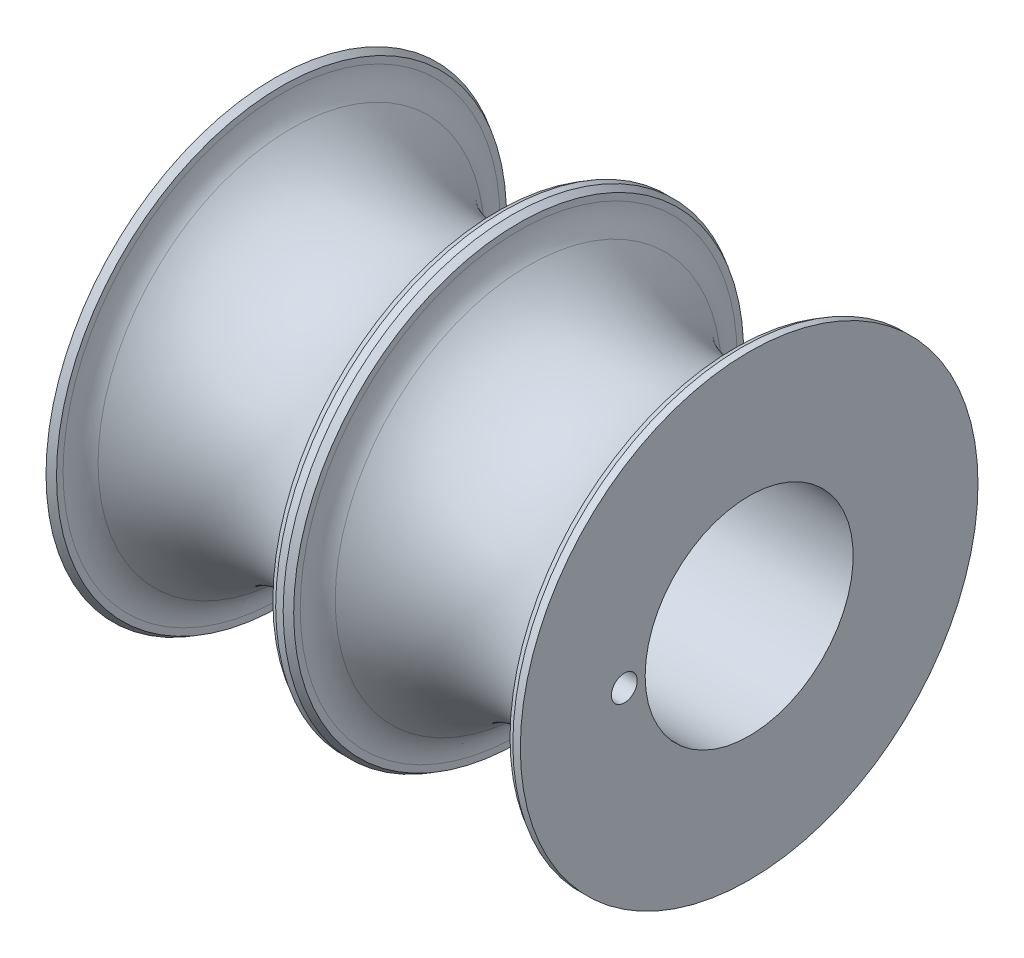
ISO-10303-21;
HEADER;
FILE_DESCRIPTION(('STEP AP214'),'2;1');
FILE_NAME('part.step','',(''),(''),'','','');
FILE_SCHEMA(('AUTOMOTIVE_DESIGN { 1 0 10303 214 1 1 1 1 }'));
ENDSEC;
DATA;
#1=APPLICATION_CONTEXT('core data for automotive mechanical design processes');
#2=APPLICATION_PROTOCOL_DEFINITION('international standard','automotive_design',2000,#1);
#3=PRODUCT_CONTEXT('',#1,'mechanical');
#4=PRODUCT('Part','Part','',(#3));
#5=PRODUCT_RELATED_PRODUCT_CATEGORY('part','',(#4));
#6=PRODUCT_DEFINITION_FORMATION('','',#4);
#7=PRODUCT_DEFINITION_CONTEXT('part definition',#1,'design');
#8=PRODUCT_DEFINITION('design','',#6,#7);
#9=PRODUCT_DEFINITION_SHAPE('','',#8);
#10=(LENGTH_UNIT() NAMED_UNIT(*) SI_UNIT(.MILLI.,.METRE.));
#11=(NAMED_UNIT(*) PLANE_ANGLE_UNIT() SI_UNIT($,.RADIAN.));
#12=(NAMED_UNIT(*) SI_UNIT($,.STERADIAN.) SOLID_ANGLE_UNIT());
#13=UNCERTAINTY_MEASURE_WITH_UNIT(LENGTH_MEASURE(1.E-05),#10,'distance_accuracy_value','');
#14=(GEOMETRIC_REPRESENTATION_CONTEXT(3) GLOBAL_UNCERTAINTY_ASSIGNED_CONTEXT((#13)) GLOBAL_UNIT_ASSIGNED_CONTEXT((#10,
#11,#12)) REPRESENTATION_CONTEXT('',''));
#15=CARTESIAN_POINT('',(0.,0.,0.));
#16=DIRECTION('',(0.,0.,1.));
#17=DIRECTION('',(1.,0.,0.));
#18=AXIS2_PLACEMENT_3D('',#15,#16,#17);
#19=CARTESIAN_POINT('',(0.,27.5,0.));
#20=DIRECTION('',(1.,0.,0.));
#21=DIRECTION('',(0.,0.,-1.));
#22=AXIS2_PLACEMENT_3D('',#19,#20,#21);
#23=PLANE('',#22);
#24=CARTESIAN_POINT('',(0.,0.,-15.));
#25=DIRECTION('',(-1.,0.,0.));
#26=DIRECTION('',(0.,0.,1.));
#27=AXIS2_PLACEMENT_3D('',#24,#25,#26);
#28=CIRCLE('',#27,1.5);
#29=CARTESIAN_POINT('',(0.,0.,-13.5));
#30=VERTEX_POINT('',#29);
#31=EDGE_CURVE('E70',#30,#30,#28,.T.);
#32=ORIENTED_EDGE('',*,*,#31,.F.);
#33=EDGE_LOOP('',(#32));
#34=FACE_BOUND('',#33,.T.);
#35=CARTESIAN_POINT('',(0.,0.,0.));
#36=DIRECTION('',(-1.,0.,0.));
#37=DIRECTION('',(0.,0.,1.));
#38=AXIS2_PLACEMENT_3D('',#35,#36,#37);
#39=CIRCLE('',#38,12.5);
#40=CARTESIAN_POINT('',(0.,0.,12.5));
#41=VERTEX_POINT('',#40);
#42=EDGE_CURVE('E81',#41,#41,#39,.T.);
#43=ORIENTED_EDGE('',*,*,#42,.F.);
#44=EDGE_LOOP('',(#43));
#45=FACE_BOUND('',#44,.T.);
#46=CARTESIAN_POINT('',(0.,0.,0.));
#47=DIRECTION('',(-1.,0.,0.));
#48=DIRECTION('',(0.,0.,1.));
#49=AXIS2_PLACEMENT_3D('',#46,#47,#48);
#50=CIRCLE('',#49,27.5);
#51=CARTESIAN_POINT('',(0.,0.,27.5));
#52=VERTEX_POINT('',#51);
#53=EDGE_CURVE('E13',#52,#52,#50,.T.);
#54=ORIENTED_EDGE('',*,*,#53,.T.);
#55=EDGE_LOOP('',(#54));
#56=FACE_BOUND('',#55,.T.);
#57=ADVANCED_FACE('F47',(#34,#45,#56),#23,.F.);
#58=CARTESIAN_POINT('',(0.800000000000009,0.,0.));
#59=DIRECTION('',(-1.,0.,0.));
#60=DIRECTION('',(0.,0.,1.));
#61=AXIS2_PLACEMENT_3D('',#58,#59,#60);
#62=CONICAL_SURFACE('',#61,27.0381197846483,0.523598775598303);
#63=ORIENTED_EDGE('',*,*,#53,.F.);
#64=EDGE_LOOP('',(#63));
#65=FACE_BOUND('',#64,.T.);
#66=CARTESIAN_POINT('',(0.800000000000009,0.,0.));
#67=DIRECTION('',(-1.,0.,0.));
#68=DIRECTION('',(0.,0.,1.));
#69=AXIS2_PLACEMENT_3D('',#66,#67,#68);
#70=CIRCLE('',#69,27.0381197846483);
#71=CARTESIAN_POINT('',(0.800000000000009,0.,27.0381197846483));
#72=VERTEX_POINT('',#71);
#73=EDGE_CURVE('E54',#72,#72,#70,.T.);
#74=ORIENTED_EDGE('',*,*,#73,.T.);
#75=EDGE_LOOP('',(#74));
#76=FACE_BOUND('',#75,.T.);
#77=ADVANCED_FACE('F134',(#65,#76),#62,.T.);
#78=CARTESIAN_POINT('',(0.800000000000011,26.25,0.));
#79=DIRECTION('',(-1.,0.,0.));
#80=DIRECTION('',(0.,0.,1.));
#81=AXIS2_PLACEMENT_3D('',#78,#79,#80);
#82=PLANE('',#81);
#83=ORIENTED_EDGE('',*,*,#73,.F.);
#84=EDGE_LOOP('',(#83));
#85=FACE_BOUND('',#84,.T.);
#86=CARTESIAN_POINT('',(0.800000000000012,0.,0.));
#87=DIRECTION('',(-1.,0.,0.));
#88=DIRECTION('',(0.,0.,1.));
#89=AXIS2_PLACEMENT_3D('',#86,#87,#88);
#90=CIRCLE('',#89,26.25);
#91=CARTESIAN_POINT('',(0.800000000000012,0.,26.25));
#92=VERTEX_POINT('',#91);
#93=EDGE_CURVE('E129',#92,#92,#90,.T.);
#94=ORIENTED_EDGE('',*,*,#93,.T.);
#95=EDGE_LOOP('',(#94));
#96=FACE_BOUND('',#95,.T.);
#97=ADVANCED_FACE('F136',(#85,#96),#82,.F.);
#98=CARTESIAN_POINT('',(5.3,0.,0.));
#99=DIRECTION('',(-1.,0.,0.));
#100=DIRECTION('',(0.,0.,1.));
#101=AXIS2_PLACEMENT_3D('',#98,#99,#100);
#102=TOROIDAL_SURFACE('',#101,26.25,4.49999999999999);
#103=ORIENTED_EDGE('',*,*,#93,.F.);
#104=EDGE_LOOP('',(#103));
#105=FACE_BOUND('',#104,.T.);
#106=CARTESIAN_POINT('',(1.97391304347827,0.,0.));
#107=DIRECTION('',(-1.,0.,0.));
#108=DIRECTION('',(0.,0.,1.));
#109=AXIS2_PLACEMENT_3D('',#106,#107,#108);
#110=CIRCLE('',#109,23.218969555142);
#111=CARTESIAN_POINT('',(1.97391304347827,0.,23.218969555142));
#112=VERTEX_POINT('',#111);
#113=EDGE_CURVE('E126',#112,#112,#110,.T.);
#114=ORIENTED_EDGE('',*,*,#113,.T.);
#115=EDGE_LOOP('',(#114));
#116=FACE_BOUND('',#115,.T.);
#117=ADVANCED_FACE('F139',(#105,#116),#102,.F.);
#118=CARTESIAN_POINT('',(13.8,0.,0.));
#119=DIRECTION('',(-1.,0.,0.));
#120=DIRECTION('',(0.,0.,1.));
#121=AXIS2_PLACEMENT_3D('',#118,#119,#120);
#122=TOROIDAL_SURFACE('',#121,33.9959666924148,16.);
#123=ORIENTED_EDGE('',*,*,#113,.F.);
#124=EDGE_LOOP('',(#123));
#125=FACE_BOUND('',#124,.T.);
#126=CARTESIAN_POINT('',(25.6260869565217,0.,0.));
#127=DIRECTION('',(-1.,0.,0.));
#128=DIRECTION('',(0.,0.,1.));
#129=AXIS2_PLACEMENT_3D('',#126,#127,#128);
#130=CIRCLE('',#129,23.218969555142);
#131=CARTESIAN_POINT('',(25.6260869565217,0.,23.218969555142));
#132=VERTEX_POINT('',#131);
#133=EDGE_CURVE('E123',#132,#132,#130,.T.);
#134=ORIENTED_EDGE('',*,*,#133,.T.);
#135=EDGE_LOOP('',(#134));
#136=FACE_BOUND('',#135,.T.);
#137=ADVANCED_FACE('F145',(#125,#136),#122,.F.);
#138=CARTESIAN_POINT('',(22.3,0.,0.));
#139=DIRECTION('',(-1.,0.,0.));
#140=DIRECTION('',(0.,0.,1.));
#141=AXIS2_PLACEMENT_3D('',#138,#139,#140);
#142=TOROIDAL_SURFACE('',#141,26.25,4.49999999999999);
#143=ORIENTED_EDGE('',*,*,#133,.F.);
#144=EDGE_LOOP('',(#143));
#145=FACE_BOUND('',#144,.T.);
#146=CARTESIAN_POINT('',(26.8,0.,0.));
#147=DIRECTION('',(-1.,0.,0.));
#148=DIRECTION('',(0.,0.,1.));
#149=AXIS2_PLACEMENT_3D('',#146,#147,#148);
#150=CIRCLE('',#149,26.25);
#151=CARTESIAN_POINT('',(26.8,0.,26.25));
#152=VERTEX_POINT('',#151);
#153=EDGE_CURVE('E120',#152,#152,#150,.T.);
#154=ORIENTED_EDGE('',*,*,#153,.T.);
#155=EDGE_LOOP('',(#154));
#156=FACE_BOUND('',#155,.T.);
#157=ADVANCED_FACE('F151',(#145,#156),#142,.F.);
#158=CARTESIAN_POINT('',(26.8,26.25,0.));
#159=DIRECTION('',(1.,0.,0.));
#160=DIRECTION('',(0.,0.,-1.));
#161=AXIS2_PLACEMENT_3D('',#158,#159,#160);
#162=PLANE('',#161);
#163=ORIENTED_EDGE('',*,*,#153,.F.);
#164=EDGE_LOOP('',(#163));
#165=FACE_BOUND('',#164,.T.);
#166=CARTESIAN_POINT('',(26.8,0.,0.));
#167=DIRECTION('',(-1.,0.,0.));
#168=DIRECTION('',(0.,0.,1.));
#169=AXIS2_PLACEMENT_3D('',#166,#167,#168);
#170=CIRCLE('',#169,27.0381197846483);
#171=CARTESIAN_POINT('',(26.8,0.,27.0381197846483));
#172=VERTEX_POINT('',#171);
#173=EDGE_CURVE('E117',#172,#172,#170,.T.);
#174=ORIENTED_EDGE('',*,*,#173,.T.);
#175=EDGE_LOOP('',(#174));
#176=FACE_BOUND('',#175,.T.);
#177=ADVANCED_FACE('F157',(#165,#176),#162,.F.);
#178=CARTESIAN_POINT('',(27.6,0.,0.));
#179=DIRECTION('',(1.,0.,0.));
#180=DIRECTION('',(0.,0.,-1.));
#181=AXIS2_PLACEMENT_3D('',#178,#179,#180);
#182=CONICAL_SURFACE('',#181,27.5,0.523598775598289);
#183=ORIENTED_EDGE('',*,*,#173,.F.);
#184=EDGE_LOOP('',(#183));
#185=FACE_BOUND('',#184,.T.);
#186=CARTESIAN_POINT('',(27.6,0.,0.));
#187=DIRECTION('',(-1.,0.,0.));
#188=DIRECTION('',(0.,0.,1.));
#189=AXIS2_PLACEMENT_3D('',#186,#187,#188);
#190=CIRCLE('',#189,27.5);
#191=CARTESIAN_POINT('',(27.6,0.,27.5));
#192=VERTEX_POINT('',#191);
#193=EDGE_CURVE('E114',#192,#192,#190,.T.);
#194=ORIENTED_EDGE('',*,*,#193,.T.);
#195=EDGE_LOOP('',(#194));
#196=FACE_BOUND('',#195,.T.);
#197=ADVANCED_FACE('F163',(#185,#196),#182,.T.);
#198=CARTESIAN_POINT('',(-27.8307874463951,0.,0.));
#199=DIRECTION('',(-1.,0.,0.));
#200=DIRECTION('',(0.,0.,1.));
#201=AXIS2_PLACEMENT_3D('',#198,#199,#200);
#202=CYLINDRICAL_SURFACE('',#201,27.5);
#203=ORIENTED_EDGE('',*,*,#193,.F.);
#204=EDGE_LOOP('',(#203));
#205=FACE_BOUND('',#204,.T.);
#206=CARTESIAN_POINT('',(28.5,0.,0.));
#207=DIRECTION('',(-1.,0.,0.));
#208=DIRECTION('',(0.,0.,1.));
#209=AXIS2_PLACEMENT_3D('',#206,#207,#208);
#210=CIRCLE('',#209,27.5);
#211=CARTESIAN_POINT('',(28.5,0.,27.5));
#212=VERTEX_POINT('',#211);
#213=EDGE_CURVE('E111',#212,#212,#210,.T.);
#214=ORIENTED_EDGE('',*,*,#213,.T.);
#215=EDGE_LOOP('',(#214));
#216=FACE_BOUND('',#215,.T.);
#217=ADVANCED_FACE('F169',(#205,#216),#202,.T.);
#218=CARTESIAN_POINT('',(29.3,0.,0.));
#219=DIRECTION('',(-1.,0.,0.));
#220=DIRECTION('',(0.,0.,1.));
#221=AXIS2_PLACEMENT_3D('',#218,#219,#220);
#222=CONICAL_SURFACE('',#221,27.0381197846483,0.523598775598314);
#223=ORIENTED_EDGE('',*,*,#213,.F.);
#224=EDGE_LOOP('',(#223));
#225=FACE_BOUND('',#224,.T.);
#226=CARTESIAN_POINT('',(29.3,0.,0.));
#227=DIRECTION('',(-1.,0.,0.));
#228=DIRECTION('',(0.,0.,1.));
#229=AXIS2_PLACEMENT_3D('',#226,#227,#228);
#230=CIRCLE('',#229,27.0381197846483);
#231=CARTESIAN_POINT('',(29.3,0.,27.0381197846483));
#232=VERTEX_POINT('',#231);
#233=EDGE_CURVE('E108',#232,#232,#230,.T.);
#234=ORIENTED_EDGE('',*,*,#233,.T.);
#235=EDGE_LOOP('',(#234));
#236=FACE_BOUND('',#235,.T.);
#237=ADVANCED_FACE('F175',(#225,#236),#222,.T.);
#238=CARTESIAN_POINT('',(29.3,26.25,0.));
#239=DIRECTION('',(-1.,0.,0.));
#240=DIRECTION('',(0.,0.,1.));
#241=AXIS2_PLACEMENT_3D('',#238,#239,#240);
#242=PLANE('',#241);
#243=ORIENTED_EDGE('',*,*,#233,.F.);
#244=EDGE_LOOP('',(#243));
#245=FACE_BOUND('',#244,.T.);
#246=CARTESIAN_POINT('',(29.3,0.,0.));
#247=DIRECTION('',(-1.,0.,0.));
#248=DIRECTION('',(0.,0.,1.));
#249=AXIS2_PLACEMENT_3D('',#246,#247,#248);
#250=CIRCLE('',#249,26.25);
#251=CARTESIAN_POINT('',(29.3,0.,26.25));
#252=VERTEX_POINT('',#251);
#253=EDGE_CURVE('E105',#252,#252,#250,.T.);
#254=ORIENTED_EDGE('',*,*,#253,.T.);
#255=EDGE_LOOP('',(#254));
#256=FACE_BOUND('',#255,.T.);
#257=ADVANCED_FACE('F181',(#245,#256),#242,.F.);
#258=CARTESIAN_POINT('',(33.8,0.,0.));
#259=DIRECTION('',(-1.,0.,0.));
#260=DIRECTION('',(0.,0.,1.));
#261=AXIS2_PLACEMENT_3D('',#258,#259,#260);
#262=TOROIDAL_SURFACE('',#261,26.25,4.49999999999999);
#263=ORIENTED_EDGE('',*,*,#253,.F.);
#264=EDGE_LOOP('',(#263));
#265=FACE_BOUND('',#264,.T.);
#266=CARTESIAN_POINT('',(30.4739130434783,0.,0.));
#267=DIRECTION('',(-1.,0.,0.));
#268=DIRECTION('',(0.,0.,1.));
#269=AXIS2_PLACEMENT_3D('',#266,#267,#268);
#270=CIRCLE('',#269,23.218969555142);
#271=CARTESIAN_POINT('',(30.4739130434783,0.,23.218969555142));
#272=VERTEX_POINT('',#271);
#273=EDGE_CURVE('E102',#272,#272,#270,.T.);
#274=ORIENTED_EDGE('',*,*,#273,.T.);
#275=EDGE_LOOP('',(#274));
#276=FACE_BOUND('',#275,.T.);
#277=ADVANCED_FACE('F187',(#265,#276),#262,.F.);
#278=CARTESIAN_POINT('',(42.3,0.,0.));
#279=DIRECTION('',(-1.,0.,0.));
#280=DIRECTION('',(0.,0.,1.));
#281=AXIS2_PLACEMENT_3D('',#278,#279,#280);
#282=TOROIDAL_SURFACE('',#281,33.9959666924148,16.);
#283=ORIENTED_EDGE('',*,*,#273,.F.);
#284=EDGE_LOOP('',(#283));
#285=FACE_BOUND('',#284,.T.);
#286=CARTESIAN_POINT('',(54.1260869565217,0.,0.));
#287=DIRECTION('',(-1.,0.,0.));
#288=DIRECTION('',(0.,0.,1.));
#289=AXIS2_PLACEMENT_3D('',#286,#287,#288);
#290=CIRCLE('',#289,23.218969555142);
#291=CARTESIAN_POINT('',(54.1260869565217,0.,23.218969555142));
#292=VERTEX_POINT('',#291);
#293=EDGE_CURVE('E99',#292,#292,#290,.T.);
#294=ORIENTED_EDGE('',*,*,#293,.T.);
#295=EDGE_LOOP('',(#294));
#296=FACE_BOUND('',#295,.T.);
#297=ADVANCED_FACE('F193',(#285,#296),#282,.F.);
#298=CARTESIAN_POINT('',(50.8,0.,0.));
#299=DIRECTION('',(-1.,0.,0.));
#300=DIRECTION('',(0.,0.,1.));
#301=AXIS2_PLACEMENT_3D('',#298,#299,#300);
#302=TOROIDAL_SURFACE('',#301,26.25,4.5);
#303=ORIENTED_EDGE('',*,*,#293,.F.);
#304=EDGE_LOOP('',(#303));
#305=FACE_BOUND('',#304,.T.);
#306=CARTESIAN_POINT('',(55.3,0.,0.));
#307=DIRECTION('',(-1.,0.,0.));
#308=DIRECTION('',(0.,0.,1.));
#309=AXIS2_PLACEMENT_3D('',#306,#307,#308);
#310=CIRCLE('',#309,26.25);
#311=CARTESIAN_POINT('',(55.3,0.,26.25));
#312=VERTEX_POINT('',#311);
#313=EDGE_CURVE('E96',#312,#312,#310,.T.);
#314=ORIENTED_EDGE('',*,*,#313,.T.);
#315=EDGE_LOOP('',(#314));
#316=FACE_BOUND('',#315,.T.);
#317=ADVANCED_FACE('F199',(#305,#316),#302,.F.);
#318=CARTESIAN_POINT('',(55.3,26.25,0.));
#319=DIRECTION('',(1.,0.,0.));
#320=DIRECTION('',(0.,0.,-1.));
#321=AXIS2_PLACEMENT_3D('',#318,#319,#320);
#322=PLANE('',#321);
#323=ORIENTED_EDGE('',*,*,#313,.F.);
#324=EDGE_LOOP('',(#323));
#325=FACE_BOUND('',#324,.T.);
#326=CARTESIAN_POINT('',(55.3,0.,0.));
#327=DIRECTION('',(-1.,0.,0.));
#328=DIRECTION('',(0.,0.,1.));
#329=AXIS2_PLACEMENT_3D('',#326,#327,#328);
#330=CIRCLE('',#329,27.0381197846483);
#331=CARTESIAN_POINT('',(55.3,0.,27.0381197846483));
#332=VERTEX_POINT('',#331);
#333=EDGE_CURVE('E93',#332,#332,#330,.T.);
#334=ORIENTED_EDGE('',*,*,#333,.T.);
#335=EDGE_LOOP('',(#334));
#336=FACE_BOUND('',#335,.T.);
#337=ADVANCED_FACE('F205',(#325,#336),#322,.F.);
#338=CARTESIAN_POINT('',(56.1,0.,0.));
#339=DIRECTION('',(1.,0.,0.));
#340=DIRECTION('',(0.,0.,-1.));
#341=AXIS2_PLACEMENT_3D('',#338,#339,#340);
#342=CONICAL_SURFACE('',#341,27.5,0.523598775598296);
#343=ORIENTED_EDGE('',*,*,#333,.F.);
#344=EDGE_LOOP('',(#343));
#345=FACE_BOUND('',#344,.T.);
#346=CARTESIAN_POINT('',(56.1,0.,0.));
#347=DIRECTION('',(-1.,0.,0.));
#348=DIRECTION('',(0.,0.,1.));
#349=AXIS2_PLACEMENT_3D('',#346,#347,#348);
#350=CIRCLE('',#349,27.5);
#351=CARTESIAN_POINT('',(56.1,0.,27.5));
#352=VERTEX_POINT('',#351);
#353=EDGE_CURVE('E90',#352,#352,#350,.T.);
#354=ORIENTED_EDGE('',*,*,#353,.T.);
#355=EDGE_LOOP('',(#354));
#356=FACE_BOUND('',#355,.T.);
#357=ADVANCED_FACE('F211',(#345,#356),#342,.T.);
#358=CARTESIAN_POINT('',(-27.8307874463951,0.,0.));
#359=DIRECTION('',(-1.,0.,0.));
#360=DIRECTION('',(0.,0.,1.));
#361=AXIS2_PLACEMENT_3D('',#358,#359,#360);
#362=CYLINDRICAL_SURFACE('',#361,27.5);
#363=ORIENTED_EDGE('',*,*,#353,.F.);
#364=EDGE_LOOP('',(#363));
#365=FACE_BOUND('',#364,.T.);
#366=CARTESIAN_POINT('',(57.,0.,0.));
#367=DIRECTION('',(-1.,0.,0.));
#368=DIRECTION('',(0.,0.,1.));
#369=AXIS2_PLACEMENT_3D('',#366,#367,#368);
#370=CIRCLE('',#369,27.5);
#371=CARTESIAN_POINT('',(57.,0.,27.5));
#372=VERTEX_POINT('',#371);
#373=EDGE_CURVE('E87',#372,#372,#370,.T.);
#374=ORIENTED_EDGE('',*,*,#373,.T.);
#375=EDGE_LOOP('',(#374));
#376=FACE_BOUND('',#375,.T.);
#377=ADVANCED_FACE('F217',(#365,#376),#362,.T.);
#378=CARTESIAN_POINT('',(57.,27.5,0.));
#379=DIRECTION('',(-1.,0.,0.));
#380=DIRECTION('',(0.,0.,1.));
#381=AXIS2_PLACEMENT_3D('',#378,#379,#380);
#382=PLANE('',#381);
#383=CARTESIAN_POINT('',(57.,0.,15.));
#384=DIRECTION('',(1.,0.,0.));
#385=DIRECTION('',(0.,0.,-1.));
#386=AXIS2_PLACEMENT_3D('',#383,#384,#385);
#387=CIRCLE('',#386,1.55);
#388=CARTESIAN_POINT('',(57.,0.,13.45));
#389=VERTEX_POINT('',#388);
#390=EDGE_CURVE('E71',#389,#389,#387,.T.);
#391=ORIENTED_EDGE('',*,*,#390,.F.);
#392=EDGE_LOOP('',(#391));
#393=FACE_BOUND('',#392,.T.);
#394=ORIENTED_EDGE('',*,*,#373,.F.);
#395=EDGE_LOOP('',(#394));
#396=FACE_BOUND('',#395,.T.);
#397=CARTESIAN_POINT('',(57.,0.,0.));
#398=DIRECTION('',(-1.,0.,0.));
#399=DIRECTION('',(0.,0.,1.));
#400=AXIS2_PLACEMENT_3D('',#397,#398,#399);
#401=CIRCLE('',#400,12.5);
#402=CARTESIAN_POINT('',(57.,0.,12.5));
#403=VERTEX_POINT('',#402);
#404=EDGE_CURVE('E84',#403,#403,#401,.T.);
#405=ORIENTED_EDGE('',*,*,#404,.T.);
#406=EDGE_LOOP('',(#405));
#407=FACE_BOUND('',#406,.T.);
#408=ADVANCED_FACE('F223',(#393,#396,#407),#382,.F.);
#409=CARTESIAN_POINT('',(-27.8307874463951,0.,0.));
#410=DIRECTION('',(-1.,0.,0.));
#411=DIRECTION('',(0.,0.,1.));
#412=AXIS2_PLACEMENT_3D('',#409,#410,#411);
#413=CYLINDRICAL_SURFACE('',#412,12.5);
#414=ORIENTED_EDGE('',*,*,#404,.F.);
#415=EDGE_LOOP('',(#414));
#416=FACE_BOUND('',#415,.T.);
#417=ORIENTED_EDGE('',*,*,#42,.T.);
#418=EDGE_LOOP('',(#417));
#419=FACE_BOUND('',#418,.T.);
#420=ADVANCED_FACE('F229',(#416,#419),#413,.F.);
#421=CARTESIAN_POINT('',(5.,0.,-15.));
#422=DIRECTION('',(-1.,0.,0.));
#423=DIRECTION('',(0.,0.,1.));
#424=AXIS2_PLACEMENT_3D('',#421,#422,#423);
#425=CONICAL_SURFACE('',#424,1.5,1.02974425867665);
#426=CARTESIAN_POINT('',(5.90129092854134,0.,-15.));
#427=VERTEX_POINT('',#426);
#428=VERTEX_LOOP('',#427);
#429=FACE_BOUND('',#428,.T.);
#430=CARTESIAN_POINT('',(5.,0.,-15.));
#431=DIRECTION('',(-1.,0.,0.));
#432=DIRECTION('',(0.,0.,1.));
#433=AXIS2_PLACEMENT_3D('',#430,#431,#432);
#434=CIRCLE('',#433,1.5);
#435=CARTESIAN_POINT('',(5.,0.,-13.5));
#436=VERTEX_POINT('',#435);
#437=EDGE_CURVE('E74',#436,#436,#434,.T.);
#438=ORIENTED_EDGE('',*,*,#437,.T.);
#439=EDGE_LOOP('',(#438));
#440=FACE_BOUND('',#439,.T.);
#441=ADVANCED_FACE('F236',(#429,#440),#425,.F.);
#442=CARTESIAN_POINT('',(0.,0.,-15.));
#443=DIRECTION('',(-1.,0.,0.));
#444=DIRECTION('',(0.,0.,1.));
#445=AXIS2_PLACEMENT_3D('',#442,#443,#444);
#446=CYLINDRICAL_SURFACE('',#445,1.5);
#447=ORIENTED_EDGE('',*,*,#437,.F.);
#448=EDGE_LOOP('',(#447));
#449=FACE_BOUND('',#448,.T.);
#450=ORIENTED_EDGE('',*,*,#31,.T.);
#451=EDGE_LOOP('',(#450));
#452=FACE_BOUND('',#451,.T.);
#453=ADVANCED_FACE('F64',(#449,#452),#446,.F.);
#454=CARTESIAN_POINT('',(52.,0.,15.));
#455=DIRECTION('',(1.,0.,0.));
#456=DIRECTION('',(0.,0.,-1.));
#457=AXIS2_PLACEMENT_3D('',#454,#455,#456);
#458=CONICAL_SURFACE('',#457,1.55,1.02974425867665);
#459=CARTESIAN_POINT('',(51.0686660405073,0.,15.));
#460=VERTEX_POINT('',#459);
#461=VERTEX_LOOP('',#460);
#462=FACE_BOUND('',#461,.T.);
#463=CARTESIAN_POINT('',(52.,0.,15.));
#464=DIRECTION('',(1.,0.,0.));
#465=DIRECTION('',(0.,0.,-1.));
#466=AXIS2_PLACEMENT_3D('',#463,#464,#465);
#467=CIRCLE('',#466,1.55);
#468=CARTESIAN_POINT('',(52.,0.,13.45));
#469=VERTEX_POINT('',#468);
#470=EDGE_CURVE('E68',#469,#469,#467,.T.);
#471=ORIENTED_EDGE('',*,*,#470,.T.);
#472=EDGE_LOOP('',(#471));
#473=FACE_BOUND('',#472,.T.);
#474=ADVANCED_FACE('F60',(#462,#473),#458,.F.);
#475=CARTESIAN_POINT('',(57.,0.,15.));
#476=DIRECTION('',(1.,0.,0.));
#477=DIRECTION('',(0.,0.,-1.));
#478=AXIS2_PLACEMENT_3D('',#475,#476,#477);
#479=CYLINDRICAL_SURFACE('',#478,1.55);
#480=ORIENTED_EDGE('',*,*,#470,.F.);
#481=EDGE_LOOP('',(#480));
#482=FACE_BOUND('',#481,.T.);
#483=ORIENTED_EDGE('',*,*,#390,.T.);
#484=EDGE_LOOP('',(#483));
#485=FACE_BOUND('',#484,.T.);
#486=ADVANCED_FACE('F63',(#482,#485),#479,.F.);
#487=CLOSED_SHELL('',(#57,#77,#97,#117,#137,#157,#177,#197,#217,#237,#257,#277,#297,#317,#337,
#357,#377,#408,#420,#441,#453,#474,#486));
#488=MANIFOLD_SOLID_BREP('B2',#487);
#489=ADVANCED_BREP_SHAPE_REPRESENTATION('',(#18,#488),#14);
#490=SHAPE_DEFINITION_REPRESENTATION(#9,#489);
ENDSEC;
END-ISO-10303-21;
